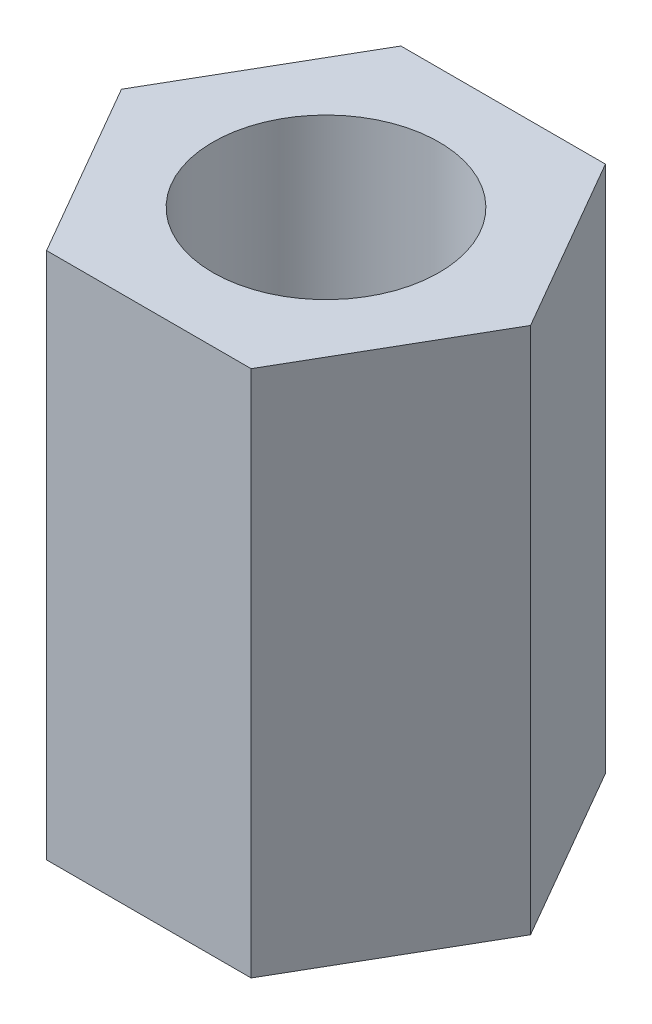
ISO-10303-21;
HEADER;
FILE_DESCRIPTION(('STEP AP214'),'2;1');
FILE_NAME('part.step','',(''),(''),'','','');
FILE_SCHEMA(('AUTOMOTIVE_DESIGN { 1 0 10303 214 1 1 1 1 }'));
ENDSEC;
DATA;
#1=APPLICATION_CONTEXT('core data for automotive mechanical design processes');
#2=APPLICATION_PROTOCOL_DEFINITION('international standard','automotive_design',2000,#1);
#3=PRODUCT_CONTEXT('',#1,'mechanical');
#4=PRODUCT('Part','Part','',(#3));
#5=PRODUCT_RELATED_PRODUCT_CATEGORY('part','',(#4));
#6=PRODUCT_DEFINITION_FORMATION('','',#4);
#7=PRODUCT_DEFINITION_CONTEXT('part definition',#1,'design');
#8=PRODUCT_DEFINITION('design','',#6,#7);
#9=PRODUCT_DEFINITION_SHAPE('','',#8);
#10=(LENGTH_UNIT() NAMED_UNIT(*) SI_UNIT(.MILLI.,.METRE.));
#11=(NAMED_UNIT(*) PLANE_ANGLE_UNIT() SI_UNIT($,.RADIAN.));
#12=(NAMED_UNIT(*) SI_UNIT($,.STERADIAN.) SOLID_ANGLE_UNIT());
#13=UNCERTAINTY_MEASURE_WITH_UNIT(LENGTH_MEASURE(1.E-05),#10,'distance_accuracy_value','');
#14=(GEOMETRIC_REPRESENTATION_CONTEXT(3) GLOBAL_UNCERTAINTY_ASSIGNED_CONTEXT((#13)) GLOBAL_UNIT_ASSIGNED_CONTEXT((#10,
#11,#12)) REPRESENTATION_CONTEXT('',''));
#15=CARTESIAN_POINT('',(0.,0.,0.));
#16=DIRECTION('',(0.,0.,1.));
#17=DIRECTION('',(1.,0.,0.));
#18=AXIS2_PLACEMENT_3D('',#15,#16,#17);
#19=CARTESIAN_POINT('',(0.,7.,0.));
#20=DIRECTION('',(0.,1.,0.));
#21=DIRECTION('',(0.,0.,1.));
#22=AXIS2_PLACEMENT_3D('',#19,#20,#21);
#23=PLANE('',#22);
#24=DIRECTION('',(1.,0.,0.));
#25=VECTOR('',#24,1.);
#26=CARTESIAN_POINT('',(-1.35677313259562,7.,2.35));
#27=LINE('',#26,#25);
#28=CARTESIAN_POINT('',(-1.35677313259562,7.,2.35));
#29=VERTEX_POINT('',#28);
#30=CARTESIAN_POINT('',(1.35677313259562,7.,2.35));
#31=VERTEX_POINT('',#30);
#32=EDGE_CURVE('E134',#29,#31,#27,.T.);
#33=ORIENTED_EDGE('',*,*,#32,.T.);
#34=DIRECTION('',(0.499999999999999,0.,-0.866025403784439));
#35=VECTOR('',#34,1.);
#36=CARTESIAN_POINT('',(1.35677313259562,7.,2.35));
#37=LINE('',#36,#35);
#38=CARTESIAN_POINT('',(2.71354626519124,7.,0.));
#39=VERTEX_POINT('',#38);
#40=EDGE_CURVE('E92',#31,#39,#37,.T.);
#41=ORIENTED_EDGE('',*,*,#40,.T.);
#42=DIRECTION('',(-0.5,0.,-0.866025403784439));
#43=VECTOR('',#42,1.);
#44=CARTESIAN_POINT('',(2.71354626519124,7.,0.));
#45=LINE('',#44,#43);
#46=CARTESIAN_POINT('',(1.35677313259562,7.,-2.35));
#47=VERTEX_POINT('',#46);
#48=EDGE_CURVE('E105',#39,#47,#45,.T.);
#49=ORIENTED_EDGE('',*,*,#48,.T.);
#50=DIRECTION('',(-1.,0.,0.));
#51=VECTOR('',#50,1.);
#52=CARTESIAN_POINT('',(1.35677313259562,7.,-2.35));
#53=LINE('',#52,#51);
#54=CARTESIAN_POINT('',(-1.35677313259562,7.,-2.35));
#55=VERTEX_POINT('',#54);
#56=EDGE_CURVE('E99',#47,#55,#53,.T.);
#57=ORIENTED_EDGE('',*,*,#56,.T.);
#58=DIRECTION('',(-0.499999999999999,0.,0.866025403784439));
#59=VECTOR('',#58,1.);
#60=CARTESIAN_POINT('',(-1.35677313259562,7.,-2.35));
#61=LINE('',#60,#59);
#62=CARTESIAN_POINT('',(-2.71354626519124,7.,0.));
#63=VERTEX_POINT('',#62);
#64=EDGE_CURVE('E103',#55,#63,#61,.T.);
#65=ORIENTED_EDGE('',*,*,#64,.T.);
#66=DIRECTION('',(0.499999999999999,0.,0.866025403784439));
#67=VECTOR('',#66,1.);
#68=CARTESIAN_POINT('',(-2.71354626519124,7.,0.));
#69=LINE('',#68,#67);
#70=EDGE_CURVE('E55',#63,#29,#69,.T.);
#71=ORIENTED_EDGE('',*,*,#70,.T.);
#72=EDGE_LOOP('',(#33,#41,#49,#57,#65,#71));
#73=FACE_BOUND('',#72,.T.);
#74=CARTESIAN_POINT('',(0.,7.,0.));
#75=DIRECTION('',(0.,1.,0.));
#76=DIRECTION('',(0.,0.,1.));
#77=AXIS2_PLACEMENT_3D('',#74,#75,#76);
#78=CIRCLE('',#77,1.5);
#79=CARTESIAN_POINT('',(0.,7.,1.5));
#80=VERTEX_POINT('',#79);
#81=EDGE_CURVE('E127',#80,#80,#78,.T.);
#82=ORIENTED_EDGE('',*,*,#81,.F.);
#83=EDGE_LOOP('',(#82));
#84=FACE_BOUND('',#83,.T.);
#85=ADVANCED_FACE('F38',(#73,#84),#23,.T.);
#86=CARTESIAN_POINT('',(0.,0.,0.));
#87=DIRECTION('',(0.,1.,0.));
#88=DIRECTION('',(0.,0.,1.));
#89=AXIS2_PLACEMENT_3D('',#86,#87,#88);
#90=PLANE('',#89);
#91=DIRECTION('',(1.,0.,0.));
#92=VECTOR('',#91,1.);
#93=CARTESIAN_POINT('',(-1.35677313259562,0.,2.35));
#94=LINE('',#93,#92);
#95=CARTESIAN_POINT('',(-1.35677313259562,0.,2.35));
#96=VERTEX_POINT('',#95);
#97=CARTESIAN_POINT('',(1.35677313259562,0.,2.35));
#98=VERTEX_POINT('',#97);
#99=EDGE_CURVE('E123',#96,#98,#94,.T.);
#100=ORIENTED_EDGE('',*,*,#99,.F.);
#101=DIRECTION('',(0.499999999999999,0.,0.866025403784439));
#102=VECTOR('',#101,1.);
#103=CARTESIAN_POINT('',(-2.71354626519124,0.,0.));
#104=LINE('',#103,#102);
#105=CARTESIAN_POINT('',(-2.71354626519124,0.,0.));
#106=VERTEX_POINT('',#105);
#107=EDGE_CURVE('E84',#106,#96,#104,.T.);
#108=ORIENTED_EDGE('',*,*,#107,.F.);
#109=DIRECTION('',(-0.499999999999999,0.,0.866025403784439));
#110=VECTOR('',#109,1.);
#111=CARTESIAN_POINT('',(-1.35677313259562,0.,-2.35));
#112=LINE('',#111,#110);
#113=CARTESIAN_POINT('',(-1.35677313259562,0.,-2.35));
#114=VERTEX_POINT('',#113);
#115=EDGE_CURVE('E78',#114,#106,#112,.T.);
#116=ORIENTED_EDGE('',*,*,#115,.F.);
#117=DIRECTION('',(-1.,0.,0.));
#118=VECTOR('',#117,1.);
#119=CARTESIAN_POINT('',(1.35677313259562,0.,-2.35));
#120=LINE('',#119,#118);
#121=CARTESIAN_POINT('',(1.35677313259562,0.,-2.35));
#122=VERTEX_POINT('',#121);
#123=EDGE_CURVE('E113',#122,#114,#120,.T.);
#124=ORIENTED_EDGE('',*,*,#123,.F.);
#125=DIRECTION('',(-0.5,0.,-0.866025403784439));
#126=VECTOR('',#125,1.);
#127=CARTESIAN_POINT('',(2.71354626519124,0.,0.));
#128=LINE('',#127,#126);
#129=CARTESIAN_POINT('',(2.71354626519124,0.,0.));
#130=VERTEX_POINT('',#129);
#131=EDGE_CURVE('E129',#130,#122,#128,.T.);
#132=ORIENTED_EDGE('',*,*,#131,.F.);
#133=DIRECTION('',(0.499999999999999,0.,-0.866025403784439));
#134=VECTOR('',#133,1.);
#135=CARTESIAN_POINT('',(1.35677313259562,0.,2.35));
#136=LINE('',#135,#134);
#137=EDGE_CURVE('E126',#98,#130,#136,.T.);
#138=ORIENTED_EDGE('',*,*,#137,.F.);
#139=EDGE_LOOP('',(#100,#108,#116,#124,#132,#138));
#140=FACE_BOUND('',#139,.T.);
#141=CARTESIAN_POINT('',(0.,0.,0.));
#142=DIRECTION('',(0.,1.,0.));
#143=DIRECTION('',(0.,0.,1.));
#144=AXIS2_PLACEMENT_3D('',#141,#142,#143);
#145=CIRCLE('',#144,1.5);
#146=CARTESIAN_POINT('',(0.,0.,1.5));
#147=VERTEX_POINT('',#146);
#148=EDGE_CURVE('E245',#147,#147,#145,.T.);
#149=ORIENTED_EDGE('',*,*,#148,.T.);
#150=EDGE_LOOP('',(#149));
#151=FACE_BOUND('',#150,.T.);
#152=ADVANCED_FACE('F143',(#140,#151),#90,.F.);
#153=CARTESIAN_POINT('',(-1.35677313259562,7.,2.35));
#154=DIRECTION('',(0.,0.,-1.));
#155=DIRECTION('',(-1.,0.,0.));
#156=AXIS2_PLACEMENT_3D('',#153,#154,#155);
#157=PLANE('',#156);
#158=ORIENTED_EDGE('',*,*,#99,.T.);
#159=DIRECTION('',(0.,-1.,0.));
#160=VECTOR('',#159,1.);
#161=CARTESIAN_POINT('',(1.35677313259562,7.,2.35));
#162=LINE('',#161,#160);
#163=EDGE_CURVE('E11',#31,#98,#162,.T.);
#164=ORIENTED_EDGE('',*,*,#163,.F.);
#165=ORIENTED_EDGE('',*,*,#32,.F.);
#166=DIRECTION('',(0.,-1.,0.));
#167=VECTOR('',#166,1.);
#168=CARTESIAN_POINT('',(-1.35677313259562,7.,2.35));
#169=LINE('',#168,#167);
#170=EDGE_CURVE('E119',#29,#96,#169,.T.);
#171=ORIENTED_EDGE('',*,*,#170,.T.);
#172=EDGE_LOOP('',(#158,#164,#165,#171));
#173=FACE_BOUND('',#172,.T.);
#174=ADVANCED_FACE('F40',(#173),#157,.F.);
#175=CARTESIAN_POINT('',(1.35677313259562,7.,2.35));
#176=DIRECTION('',(-0.866025403784439,0.,-0.499999999999999));
#177=DIRECTION('',(-0.499999999999999,0.,0.866025403784439));
#178=AXIS2_PLACEMENT_3D('',#175,#176,#177);
#179=PLANE('',#178);
#180=ORIENTED_EDGE('',*,*,#137,.T.);
#181=DIRECTION('',(0.,-1.,0.));
#182=VECTOR('',#181,1.);
#183=CARTESIAN_POINT('',(2.71354626519124,7.,0.));
#184=LINE('',#183,#182);
#185=EDGE_CURVE('E47',#39,#130,#184,.T.);
#186=ORIENTED_EDGE('',*,*,#185,.F.);
#187=ORIENTED_EDGE('',*,*,#40,.F.);
#188=ORIENTED_EDGE('',*,*,#163,.T.);
#189=EDGE_LOOP('',(#180,#186,#187,#188));
#190=FACE_BOUND('',#189,.T.);
#191=ADVANCED_FACE('F168',(#190),#179,.F.);
#192=CARTESIAN_POINT('',(2.71354626519124,7.,0.));
#193=DIRECTION('',(-0.866025403784439,0.,0.5));
#194=DIRECTION('',(0.5,0.,0.866025403784439));
#195=AXIS2_PLACEMENT_3D('',#192,#193,#194);
#196=PLANE('',#195);
#197=ORIENTED_EDGE('',*,*,#131,.T.);
#198=DIRECTION('',(0.,-1.,0.));
#199=VECTOR('',#198,1.);
#200=CARTESIAN_POINT('',(1.35677313259562,7.,-2.35));
#201=LINE('',#200,#199);
#202=EDGE_CURVE('E114',#47,#122,#201,.T.);
#203=ORIENTED_EDGE('',*,*,#202,.F.);
#204=ORIENTED_EDGE('',*,*,#48,.F.);
#205=ORIENTED_EDGE('',*,*,#185,.T.);
#206=EDGE_LOOP('',(#197,#203,#204,#205));
#207=FACE_BOUND('',#206,.T.);
#208=ADVANCED_FACE('F140',(#207),#196,.F.);
#209=CARTESIAN_POINT('',(1.35677313259562,7.,-2.35));
#210=DIRECTION('',(0.,0.,1.));
#211=DIRECTION('',(1.,0.,0.));
#212=AXIS2_PLACEMENT_3D('',#209,#210,#211);
#213=PLANE('',#212);
#214=ORIENTED_EDGE('',*,*,#123,.T.);
#215=DIRECTION('',(0.,-1.,0.));
#216=VECTOR('',#215,1.);
#217=CARTESIAN_POINT('',(-1.35677313259562,7.,-2.35));
#218=LINE('',#217,#216);
#219=EDGE_CURVE('E110',#55,#114,#218,.T.);
#220=ORIENTED_EDGE('',*,*,#219,.F.);
#221=ORIENTED_EDGE('',*,*,#56,.F.);
#222=ORIENTED_EDGE('',*,*,#202,.T.);
#223=EDGE_LOOP('',(#214,#220,#221,#222));
#224=FACE_BOUND('',#223,.T.);
#225=ADVANCED_FACE('F111',(#224),#213,.F.);
#226=CARTESIAN_POINT('',(-1.35677313259562,7.,-2.35));
#227=DIRECTION('',(0.866025403784439,0.,0.499999999999999));
#228=DIRECTION('',(0.499999999999999,0.,-0.866025403784439));
#229=AXIS2_PLACEMENT_3D('',#226,#227,#228);
#230=PLANE('',#229);
#231=ORIENTED_EDGE('',*,*,#115,.T.);
#232=DIRECTION('',(0.,-1.,0.));
#233=VECTOR('',#232,1.);
#234=CARTESIAN_POINT('',(-2.71354626519124,7.,0.));
#235=LINE('',#234,#233);
#236=EDGE_CURVE('E115',#63,#106,#235,.T.);
#237=ORIENTED_EDGE('',*,*,#236,.F.);
#238=ORIENTED_EDGE('',*,*,#64,.F.);
#239=ORIENTED_EDGE('',*,*,#219,.T.);
#240=EDGE_LOOP('',(#231,#237,#238,#239));
#241=FACE_BOUND('',#240,.T.);
#242=ADVANCED_FACE('F117',(#241),#230,.F.);
#243=CARTESIAN_POINT('',(-2.71354626519124,7.,0.));
#244=DIRECTION('',(0.866025403784439,0.,-0.499999999999999));
#245=DIRECTION('',(-0.499999999999999,0.,-0.866025403784439));
#246=AXIS2_PLACEMENT_3D('',#243,#244,#245);
#247=PLANE('',#246);
#248=ORIENTED_EDGE('',*,*,#107,.T.);
#249=ORIENTED_EDGE('',*,*,#170,.F.);
#250=ORIENTED_EDGE('',*,*,#70,.F.);
#251=ORIENTED_EDGE('',*,*,#236,.T.);
#252=EDGE_LOOP('',(#248,#249,#250,#251));
#253=FACE_BOUND('',#252,.T.);
#254=ADVANCED_FACE('F148',(#253),#247,.F.);
#255=CARTESIAN_POINT('',(0.,7.,0.));
#256=DIRECTION('',(0.,-1.,0.));
#257=DIRECTION('',(0.,0.,-1.));
#258=AXIS2_PLACEMENT_3D('',#255,#256,#257);
#259=CYLINDRICAL_SURFACE('',#258,1.5);
#260=ORIENTED_EDGE('',*,*,#81,.T.);
#261=EDGE_LOOP('',(#260));
#262=FACE_BOUND('',#261,.T.);
#263=ORIENTED_EDGE('',*,*,#148,.F.);
#264=EDGE_LOOP('',(#263));
#265=FACE_BOUND('',#264,.T.);
#266=ADVANCED_FACE('F150',(#262,#265),#259,.F.);
#267=CLOSED_SHELL('',(#85,#152,#174,#191,#208,#225,#242,#254,#266));
#268=MANIFOLD_SOLID_BREP('B2',#267);
#269=ADVANCED_BREP_SHAPE_REPRESENTATION('',(#18,#268),#14);
#270=SHAPE_DEFINITION_REPRESENTATION(#9,#269);
ENDSEC;
END-ISO-10303-21;
